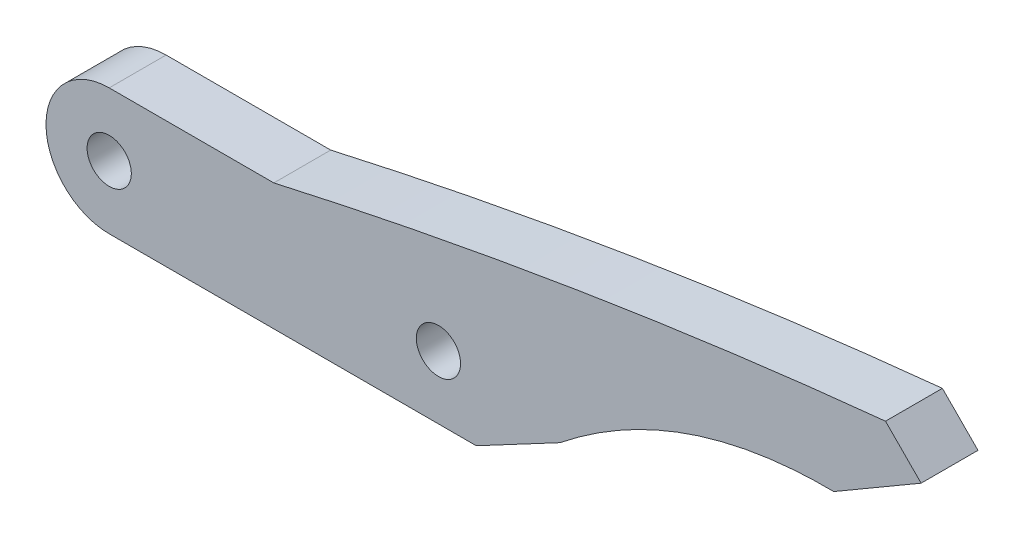
ISO-10303-21;
HEADER;
FILE_DESCRIPTION(('STEP AP214'),'2;1');
FILE_NAME('part.step','',(''),(''),'','','');
FILE_SCHEMA(('AUTOMOTIVE_DESIGN { 1 0 10303 214 1 1 1 1 }'));
ENDSEC;
DATA;
#1=APPLICATION_CONTEXT('core data for automotive mechanical design processes');
#2=APPLICATION_PROTOCOL_DEFINITION('international standard','automotive_design',2000,#1);
#3=PRODUCT_CONTEXT('',#1,'mechanical');
#4=PRODUCT('Part','Part','',(#3));
#5=PRODUCT_RELATED_PRODUCT_CATEGORY('part','',(#4));
#6=PRODUCT_DEFINITION_FORMATION('','',#4);
#7=PRODUCT_DEFINITION_CONTEXT('part definition',#1,'design');
#8=PRODUCT_DEFINITION('design','',#6,#7);
#9=PRODUCT_DEFINITION_SHAPE('','',#8);
#10=(LENGTH_UNIT() NAMED_UNIT(*) SI_UNIT(.MILLI.,.METRE.));
#11=(NAMED_UNIT(*) PLANE_ANGLE_UNIT() SI_UNIT($,.RADIAN.));
#12=(NAMED_UNIT(*) SI_UNIT($,.STERADIAN.) SOLID_ANGLE_UNIT());
#13=UNCERTAINTY_MEASURE_WITH_UNIT(LENGTH_MEASURE(1.E-05),#10,'distance_accuracy_value','');
#14=(GEOMETRIC_REPRESENTATION_CONTEXT(3) GLOBAL_UNCERTAINTY_ASSIGNED_CONTEXT((#13)) GLOBAL_UNIT_ASSIGNED_CONTEXT((#10,
#11,#12)) REPRESENTATION_CONTEXT('',''));
#15=CARTESIAN_POINT('',(0.,0.,0.));
#16=DIRECTION('',(0.,0.,1.));
#17=DIRECTION('',(1.,0.,0.));
#18=AXIS2_PLACEMENT_3D('',#15,#16,#17);
#19=CARTESIAN_POINT('',(0.,5.,4.5));
#20=DIRECTION('',(0.,-1.,0.));
#21=DIRECTION('',(0.,0.,-1.));
#22=AXIS2_PLACEMENT_3D('',#19,#20,#21);
#23=PLANE('',#22);
#24=DIRECTION('',(0.,0.,1.));
#25=VECTOR('',#24,1.);
#26=CARTESIAN_POINT('',(0.,5.,-54.2325979228886));
#27=LINE('',#26,#25);
#28=CARTESIAN_POINT('',(0.,5.,0.));
#29=VERTEX_POINT('',#28);
#30=CARTESIAN_POINT('',(0.,5.,4.5));
#31=VERTEX_POINT('',#30);
#32=EDGE_CURVE('E57',#29,#31,#27,.T.);
#33=ORIENTED_EDGE('',*,*,#32,.F.);
#34=DIRECTION('',(-1.,0.,0.));
#35=VECTOR('',#34,1.);
#36=CARTESIAN_POINT('',(0.,5.,0.));
#37=LINE('',#36,#35);
#38=CARTESIAN_POINT('',(-13.0230884961492,5.,0.));
#39=VERTEX_POINT('',#38);
#40=EDGE_CURVE('E75',#29,#39,#37,.T.);
#41=ORIENTED_EDGE('',*,*,#40,.T.);
#42=DIRECTION('',(0.,0.,-1.));
#43=VECTOR('',#42,1.);
#44=CARTESIAN_POINT('',(-13.0230884961492,5.,4.5));
#45=LINE('',#44,#43);
#46=CARTESIAN_POINT('',(-13.0230884961492,5.,4.5));
#47=VERTEX_POINT('',#46);
#48=EDGE_CURVE('E47',#47,#39,#45,.T.);
#49=ORIENTED_EDGE('',*,*,#48,.F.);
#50=DIRECTION('',(-1.,0.,0.));
#51=VECTOR('',#50,1.);
#52=CARTESIAN_POINT('',(0.,5.,4.5));
#53=LINE('',#52,#51);
#54=EDGE_CURVE('E62',#31,#47,#53,.T.);
#55=ORIENTED_EDGE('',*,*,#54,.F.);
#56=EDGE_LOOP('',(#33,#41,#49,#55));
#57=FACE_BOUND('',#56,.T.);
#58=ADVANCED_FACE('F41',(#57),#23,.F.);
#59=CARTESIAN_POINT('',(-13.0230884961492,0.,4.5));
#60=DIRECTION('',(0.,0.,-1.));
#61=DIRECTION('',(-1.,0.,0.));
#62=AXIS2_PLACEMENT_3D('',#59,#60,#61);
#63=CYLINDRICAL_SURFACE('',#62,5.);
#64=CARTESIAN_POINT('',(-13.0230884961492,0.,0.));
#65=DIRECTION('',(0.,0.,1.));
#66=DIRECTION('',(1.,0.,0.));
#67=AXIS2_PLACEMENT_3D('',#64,#65,#66);
#68=CIRCLE('',#67,5.);
#69=CARTESIAN_POINT('',(-13.0230884961492,-5.,0.));
#70=VERTEX_POINT('',#69);
#71=EDGE_CURVE('E86',#39,#70,#68,.T.);
#72=ORIENTED_EDGE('',*,*,#71,.T.);
#73=DIRECTION('',(0.,0.,-1.));
#74=VECTOR('',#73,1.);
#75=CARTESIAN_POINT('',(-13.0230884961492,-5.,4.5));
#76=LINE('',#75,#74);
#77=CARTESIAN_POINT('',(-13.0230884961492,-5.,4.5));
#78=VERTEX_POINT('',#77);
#79=EDGE_CURVE('E11',#78,#70,#76,.T.);
#80=ORIENTED_EDGE('',*,*,#79,.F.);
#81=CARTESIAN_POINT('',(-13.0230884961492,0.,4.5));
#82=DIRECTION('',(0.,0.,1.));
#83=DIRECTION('',(1.,0.,0.));
#84=AXIS2_PLACEMENT_3D('',#81,#82,#83);
#85=CIRCLE('',#84,5.);
#86=EDGE_CURVE('E88',#47,#78,#85,.T.);
#87=ORIENTED_EDGE('',*,*,#86,.F.);
#88=ORIENTED_EDGE('',*,*,#48,.T.);
#89=EDGE_LOOP('',(#72,#80,#87,#88));
#90=FACE_BOUND('',#89,.T.);
#91=ADVANCED_FACE('F84',(#90),#63,.T.);
#92=CARTESIAN_POINT('',(0.,-5.,4.5));
#93=DIRECTION('',(0.,-1.,0.));
#94=DIRECTION('',(0.,0.,-1.));
#95=AXIS2_PLACEMENT_3D('',#92,#93,#94);
#96=PLANE('',#95);
#97=DIRECTION('',(-1.,0.,0.));
#98=VECTOR('',#97,1.);
#99=CARTESIAN_POINT('',(0.,-5.,0.));
#100=LINE('',#99,#98);
#101=CARTESIAN_POINT('',(16.0130884961492,-5.,0.));
#102=VERTEX_POINT('',#101);
#103=EDGE_CURVE('E79',#102,#70,#100,.T.);
#104=ORIENTED_EDGE('',*,*,#103,.F.);
#105=DIRECTION('',(0.,0.,1.));
#106=VECTOR('',#105,1.);
#107=CARTESIAN_POINT('',(16.0130884961492,-5.,-54.2325979228886));
#108=LINE('',#107,#106);
#109=CARTESIAN_POINT('',(16.0130884961492,-5.,4.5));
#110=VERTEX_POINT('',#109);
#111=EDGE_CURVE('E144',#102,#110,#108,.T.);
#112=ORIENTED_EDGE('',*,*,#111,.T.);
#113=DIRECTION('',(-1.,0.,0.));
#114=VECTOR('',#113,1.);
#115=CARTESIAN_POINT('',(0.,-5.,4.5));
#116=LINE('',#115,#114);
#117=EDGE_CURVE('E109',#110,#78,#116,.T.);
#118=ORIENTED_EDGE('',*,*,#117,.T.);
#119=ORIENTED_EDGE('',*,*,#79,.T.);
#120=EDGE_LOOP('',(#104,#112,#118,#119));
#121=FACE_BOUND('',#120,.T.);
#122=ADVANCED_FACE('F131',(#121),#96,.T.);
#123=CARTESIAN_POINT('',(-13.0230884961492,0.,4.5));
#124=DIRECTION('',(0.,0.,-1.));
#125=DIRECTION('',(-1.,0.,0.));
#126=AXIS2_PLACEMENT_3D('',#123,#124,#125);
#127=CYLINDRICAL_SURFACE('',#126,1.75);
#128=CARTESIAN_POINT('',(-13.0230884961492,0.,4.5));
#129=DIRECTION('',(0.,0.,1.));
#130=DIRECTION('',(1.,0.,0.));
#131=AXIS2_PLACEMENT_3D('',#128,#129,#130);
#132=CIRCLE('',#131,1.75);
#133=CARTESIAN_POINT('',(-11.2730884961492,0.,4.5));
#134=VERTEX_POINT('',#133);
#135=EDGE_CURVE('E104',#134,#134,#132,.T.);
#136=ORIENTED_EDGE('',*,*,#135,.T.);
#137=EDGE_LOOP('',(#136));
#138=FACE_BOUND('',#137,.T.);
#139=CARTESIAN_POINT('',(-13.0230884961492,0.,0.));
#140=DIRECTION('',(0.,0.,1.));
#141=DIRECTION('',(1.,0.,0.));
#142=AXIS2_PLACEMENT_3D('',#139,#140,#141);
#143=CIRCLE('',#142,1.75);
#144=CARTESIAN_POINT('',(-11.2730884961492,0.,0.));
#145=VERTEX_POINT('',#144);
#146=EDGE_CURVE('E92',#145,#145,#143,.T.);
#147=ORIENTED_EDGE('',*,*,#146,.F.);
#148=EDGE_LOOP('',(#147));
#149=FACE_BOUND('',#148,.T.);
#150=ADVANCED_FACE('F43',(#138,#149),#127,.F.);
#151=CARTESIAN_POINT('',(13.0230884961492,0.,4.5));
#152=DIRECTION('',(0.,0.,-1.));
#153=DIRECTION('',(-1.,0.,0.));
#154=AXIS2_PLACEMENT_3D('',#151,#152,#153);
#155=CYLINDRICAL_SURFACE('',#154,1.75);
#156=CARTESIAN_POINT('',(13.0230884961492,0.,4.5));
#157=DIRECTION('',(0.,0.,1.));
#158=DIRECTION('',(1.,0.,0.));
#159=AXIS2_PLACEMENT_3D('',#156,#157,#158);
#160=CIRCLE('',#159,1.75);
#161=CARTESIAN_POINT('',(14.7730884961492,0.,4.5));
#162=VERTEX_POINT('',#161);
#163=EDGE_CURVE('E87',#162,#162,#160,.F.);
#164=ORIENTED_EDGE('',*,*,#163,.F.);
#165=EDGE_LOOP('',(#164));
#166=FACE_BOUND('',#165,.T.);
#167=CARTESIAN_POINT('',(13.0230884961492,0.,0.));
#168=DIRECTION('',(0.,0.,1.));
#169=DIRECTION('',(1.,0.,0.));
#170=AXIS2_PLACEMENT_3D('',#167,#168,#169);
#171=CIRCLE('',#170,1.75);
#172=CARTESIAN_POINT('',(14.7730884961492,0.,0.));
#173=VERTEX_POINT('',#172);
#174=EDGE_CURVE('E80',#173,#173,#171,.F.);
#175=ORIENTED_EDGE('',*,*,#174,.T.);
#176=EDGE_LOOP('',(#175));
#177=FACE_BOUND('',#176,.T.);
#178=ADVANCED_FACE('F122',(#166,#177),#155,.F.);
#179=CARTESIAN_POINT('',(0.,0.,4.5));
#180=DIRECTION('',(0.,0.,1.));
#181=DIRECTION('',(1.,0.,0.));
#182=AXIS2_PLACEMENT_3D('',#179,#180,#181);
#183=PLANE('',#182);
#184=ORIENTED_EDGE('',*,*,#117,.F.);
#185=DIRECTION('',(0.882942972945771,0.469480251475697,0.));
#186=VECTOR('',#185,1.);
#187=CARTESIAN_POINT('',(22.6330884961492,-1.48,4.5));
#188=LINE('',#187,#186);
#189=CARTESIAN_POINT('',(22.6330884961492,-1.48,4.5));
#190=VERTEX_POINT('',#189);
#191=EDGE_CURVE('E165',#110,#190,#188,.T.);
#192=ORIENTED_EDGE('',*,*,#191,.T.);
#193=CARTESIAN_POINT('',(22.6330884961492,-1.48,4.5));
#194=CARTESIAN_POINT('',(32.1692392442014,6.15734830451268,4.5));
#195=CARTESIAN_POINT('',(44.2930884961492,6.,4.5));
#196=B_SPLINE_CURVE_WITH_KNOTS('',2,(#193,#194,#195),.UNSPECIFIED.,.F.,.F.,(3,3),(0.,1.),.UNSPECIFIED.);
#197=CARTESIAN_POINT('',(44.2930884961492,6.,4.5));
#198=VERTEX_POINT('',#197);
#199=EDGE_CURVE('E179',#190,#198,#196,.T.);
#200=ORIENTED_EDGE('',*,*,#199,.T.);
#201=DIRECTION('',(0.86384948775814,0.50375,0.));
#202=VECTOR('',#201,1.);
#203=CARTESIAN_POINT('',(51.2038843982143,10.03,4.5));
#204=LINE('',#203,#202);
#205=CARTESIAN_POINT('',(51.2038843982143,10.03,4.5));
#206=VERTEX_POINT('',#205);
#207=EDGE_CURVE('E180',#198,#206,#204,.T.);
#208=ORIENTED_EDGE('',*,*,#207,.T.);
#209=DIRECTION('',(-0.70420167565833,0.71,0.));
#210=VECTOR('',#209,1.);
#211=CARTESIAN_POINT('',(48.387077695581,12.87,4.5));
#212=LINE('',#211,#210);
#213=CARTESIAN_POINT('',(48.387077695581,12.87,4.5));
#214=VERTEX_POINT('',#213);
#215=EDGE_CURVE('E168',#206,#214,#212,.T.);
#216=ORIENTED_EDGE('',*,*,#215,.T.);
#217=CARTESIAN_POINT('',(48.387077695581,12.87,4.5));
#218=CARTESIAN_POINT('',(23.9570757961283,10.4180615828169,4.5));
#219=CARTESIAN_POINT('',(0.,5.,4.5));
#220=B_SPLINE_CURVE_WITH_KNOTS('',2,(#217,#218,#219),.UNSPECIFIED.,.F.,.F.,(3,3),(0.,1.),.UNSPECIFIED.);
#221=EDGE_CURVE('E188',#214,#31,#220,.T.);
#222=ORIENTED_EDGE('',*,*,#221,.T.);
#223=ORIENTED_EDGE('',*,*,#54,.T.);
#224=ORIENTED_EDGE('',*,*,#86,.T.);
#225=EDGE_LOOP('',(#184,#192,#200,#208,#216,#222,#223,#224));
#226=FACE_BOUND('',#225,.T.);
#227=ORIENTED_EDGE('',*,*,#135,.F.);
#228=EDGE_LOOP('',(#227));
#229=FACE_BOUND('',#228,.T.);
#230=ORIENTED_EDGE('',*,*,#163,.T.);
#231=EDGE_LOOP('',(#230));
#232=FACE_BOUND('',#231,.T.);
#233=ADVANCED_FACE('F119',(#226,#229,#232),#183,.T.);
#234=CARTESIAN_POINT('',(0.,0.,0.));
#235=DIRECTION('',(0.,0.,1.));
#236=DIRECTION('',(1.,0.,0.));
#237=AXIS2_PLACEMENT_3D('',#234,#235,#236);
#238=PLANE('',#237);
#239=DIRECTION('',(-0.882942972945771,-0.469480251475697,0.));
#240=VECTOR('',#239,1.);
#241=CARTESIAN_POINT('',(22.6330884961492,-1.48,0.));
#242=LINE('',#241,#240);
#243=CARTESIAN_POINT('',(22.6330884961492,-1.48,0.));
#244=VERTEX_POINT('',#243);
#245=EDGE_CURVE('E153',#244,#102,#242,.T.);
#246=ORIENTED_EDGE('',*,*,#245,.T.);
#247=ORIENTED_EDGE('',*,*,#103,.T.);
#248=ORIENTED_EDGE('',*,*,#71,.F.);
#249=ORIENTED_EDGE('',*,*,#40,.F.);
#250=CARTESIAN_POINT('',(48.387077695581,12.87,0.));
#251=CARTESIAN_POINT('',(23.9570757961283,10.4180615828169,0.));
#252=CARTESIAN_POINT('',(0.,5.,0.));
#253=B_SPLINE_CURVE_WITH_KNOTS('',2,(#250,#251,#252),.UNSPECIFIED.,.F.,.F.,(3,3),(0.,1.),.UNSPECIFIED.);
#254=CARTESIAN_POINT('',(48.387077695581,12.87,0.));
#255=VERTEX_POINT('',#254);
#256=EDGE_CURVE('E97',#29,#255,#253,.F.);
#257=ORIENTED_EDGE('',*,*,#256,.T.);
#258=DIRECTION('',(0.70420167565833,-0.71,0.));
#259=VECTOR('',#258,1.);
#260=CARTESIAN_POINT('',(48.387077695581,12.87,0.));
#261=LINE('',#260,#259);
#262=CARTESIAN_POINT('',(51.2038843982143,10.03,0.));
#263=VERTEX_POINT('',#262);
#264=EDGE_CURVE('E323',#255,#263,#261,.T.);
#265=ORIENTED_EDGE('',*,*,#264,.T.);
#266=DIRECTION('',(-0.863849487758139,-0.50375,0.));
#267=VECTOR('',#266,1.);
#268=CARTESIAN_POINT('',(51.2038843982143,10.03,0.));
#269=LINE('',#268,#267);
#270=CARTESIAN_POINT('',(44.2930884961492,6.,0.));
#271=VERTEX_POINT('',#270);
#272=EDGE_CURVE('E316',#263,#271,#269,.T.);
#273=ORIENTED_EDGE('',*,*,#272,.T.);
#274=CARTESIAN_POINT('',(22.6330884961492,-1.48,0.));
#275=CARTESIAN_POINT('',(32.1692392442014,6.15734830451268,0.));
#276=CARTESIAN_POINT('',(44.2930884961492,6.,0.));
#277=B_SPLINE_CURVE_WITH_KNOTS('',2,(#274,#275,#276),.UNSPECIFIED.,.F.,.F.,(3,3),(0.,1.),.UNSPECIFIED.);
#278=EDGE_CURVE('E152',#271,#244,#277,.F.);
#279=ORIENTED_EDGE('',*,*,#278,.T.);
#280=EDGE_LOOP('',(#246,#247,#248,#249,#257,#265,#273,#279));
#281=FACE_BOUND('',#280,.T.);
#282=ORIENTED_EDGE('',*,*,#146,.T.);
#283=EDGE_LOOP('',(#282));
#284=FACE_BOUND('',#283,.T.);
#285=ORIENTED_EDGE('',*,*,#174,.F.);
#286=EDGE_LOOP('',(#285));
#287=FACE_BOUND('',#286,.T.);
#288=ADVANCED_FACE('F91',(#281,#284,#287),#238,.F.);
#289=CARTESIAN_POINT('',(48.387077695581,12.87,-54.2325979228886));
#290=CARTESIAN_POINT('',(23.9570757961283,10.4180615828169,-54.2325979228886));
#291=CARTESIAN_POINT('',(0.,5.,-54.2325979228886));
#292=B_SPLINE_CURVE_WITH_KNOTS('',2,(#289,#290,#291),.UNSPECIFIED.,.F.,.F.,(3,3),(0.,1.),.UNSPECIFIED.);
#293=DIRECTION('',(0.,0.,1.));
#294=VECTOR('',#293,1.);
#295=SURFACE_OF_LINEAR_EXTRUSION('',#292,#294);
#296=ORIENTED_EDGE('',*,*,#256,.F.);
#297=ORIENTED_EDGE('',*,*,#32,.T.);
#298=ORIENTED_EDGE('',*,*,#221,.F.);
#299=DIRECTION('',(0.,0.,1.));
#300=VECTOR('',#299,1.);
#301=CARTESIAN_POINT('',(48.387077695581,12.87,-54.2325979228886));
#302=LINE('',#301,#300);
#303=EDGE_CURVE('E156',#255,#214,#302,.T.);
#304=ORIENTED_EDGE('',*,*,#303,.F.);
#305=EDGE_LOOP('',(#296,#297,#298,#304));
#306=FACE_BOUND('',#305,.T.);
#307=ADVANCED_FACE('F220',(#306),#295,.T.);
#308=CARTESIAN_POINT('',(48.387077695581,12.87,-54.2325979228886));
#309=DIRECTION('',(0.71,0.70420167565833,0.));
#310=DIRECTION('',(-0.70420167565833,0.71,0.));
#311=AXIS2_PLACEMENT_3D('',#308,#309,#310);
#312=PLANE('',#311);
#313=ORIENTED_EDGE('',*,*,#264,.F.);
#314=ORIENTED_EDGE('',*,*,#303,.T.);
#315=ORIENTED_EDGE('',*,*,#215,.F.);
#316=DIRECTION('',(0.,0.,1.));
#317=VECTOR('',#316,1.);
#318=CARTESIAN_POINT('',(51.2038843982143,10.03,-54.2325979228886));
#319=LINE('',#318,#317);
#320=EDGE_CURVE('E169',#263,#206,#319,.T.);
#321=ORIENTED_EDGE('',*,*,#320,.F.);
#322=EDGE_LOOP('',(#313,#314,#315,#321));
#323=FACE_BOUND('',#322,.T.);
#324=ADVANCED_FACE('F219',(#323),#312,.T.);
#325=CARTESIAN_POINT('',(51.2038843982143,10.03,-54.2325979228886));
#326=DIRECTION('',(0.50375,-0.863849487758139,0.));
#327=DIRECTION('',(0.863849487758139,0.50375,0.));
#328=AXIS2_PLACEMENT_3D('',#325,#326,#327);
#329=PLANE('',#328);
#330=ORIENTED_EDGE('',*,*,#272,.F.);
#331=ORIENTED_EDGE('',*,*,#320,.T.);
#332=ORIENTED_EDGE('',*,*,#207,.F.);
#333=DIRECTION('',(0.,0.,1.));
#334=VECTOR('',#333,1.);
#335=CARTESIAN_POINT('',(44.2930884961492,6.,-54.2325979228886));
#336=LINE('',#335,#334);
#337=EDGE_CURVE('E162',#271,#198,#336,.T.);
#338=ORIENTED_EDGE('',*,*,#337,.F.);
#339=EDGE_LOOP('',(#330,#331,#332,#338));
#340=FACE_BOUND('',#339,.T.);
#341=ADVANCED_FACE('F212',(#340),#329,.T.);
#342=CARTESIAN_POINT('',(22.6330884961492,-1.48,-54.2325979228886));
#343=CARTESIAN_POINT('',(32.1692392442014,6.15734830451268,-54.2325979228886));
#344=CARTESIAN_POINT('',(44.2930884961492,6.,-54.2325979228886));
#345=B_SPLINE_CURVE_WITH_KNOTS('',2,(#342,#343,#344),.UNSPECIFIED.,.F.,.F.,(3,3),(0.,1.),.UNSPECIFIED.);
#346=DIRECTION('',(0.,0.,1.));
#347=VECTOR('',#346,1.);
#348=SURFACE_OF_LINEAR_EXTRUSION('',#345,#347);
#349=ORIENTED_EDGE('',*,*,#278,.F.);
#350=ORIENTED_EDGE('',*,*,#337,.T.);
#351=ORIENTED_EDGE('',*,*,#199,.F.);
#352=DIRECTION('',(0.,0.,1.));
#353=VECTOR('',#352,1.);
#354=CARTESIAN_POINT('',(22.6330884961492,-1.48,-54.2325979228886));
#355=LINE('',#354,#353);
#356=EDGE_CURVE('E161',#244,#190,#355,.T.);
#357=ORIENTED_EDGE('',*,*,#356,.F.);
#358=EDGE_LOOP('',(#349,#350,#351,#357));
#359=FACE_BOUND('',#358,.T.);
#360=ADVANCED_FACE('F206',(#359),#348,.T.);
#361=CARTESIAN_POINT('',(22.6330884961492,-1.48,-54.2325979228886));
#362=DIRECTION('',(0.469480251475697,-0.882942972945771,0.));
#363=DIRECTION('',(0.882942972945771,0.469480251475697,0.));
#364=AXIS2_PLACEMENT_3D('',#361,#362,#363);
#365=PLANE('',#364);
#366=ORIENTED_EDGE('',*,*,#245,.F.);
#367=ORIENTED_EDGE('',*,*,#356,.T.);
#368=ORIENTED_EDGE('',*,*,#191,.F.);
#369=ORIENTED_EDGE('',*,*,#111,.F.);
#370=EDGE_LOOP('',(#366,#367,#368,#369));
#371=FACE_BOUND('',#370,.T.);
#372=ADVANCED_FACE('F158',(#371),#365,.T.);
#373=CLOSED_SHELL('',(#58,#91,#122,#150,#178,#233,#288,#307,#324,#341,#360,#372));
#374=MANIFOLD_SOLID_BREP('B2',#373);
#375=ADVANCED_BREP_SHAPE_REPRESENTATION('',(#18,#374),#14);
#376=SHAPE_DEFINITION_REPRESENTATION(#9,#375);
ENDSEC;
END-ISO-10303-21;
